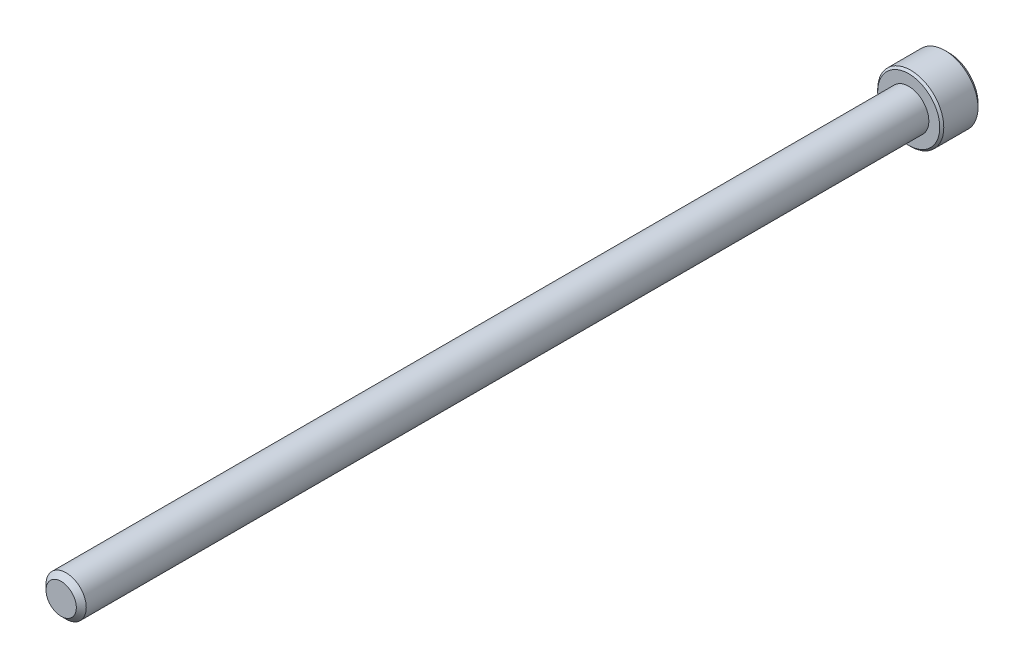
ISO-10303-21;
HEADER;
FILE_DESCRIPTION(('STEP AP214'),'2;1');
FILE_NAME('part.step','',(''),(''),'','','');
FILE_SCHEMA(('AUTOMOTIVE_DESIGN { 1 0 10303 214 1 1 1 1 }'));
ENDSEC;
DATA;
#1=APPLICATION_CONTEXT('core data for automotive mechanical design processes');
#2=APPLICATION_PROTOCOL_DEFINITION('international standard','automotive_design',2000,#1);
#3=PRODUCT_CONTEXT('',#1,'mechanical');
#4=PRODUCT('Part','Part','',(#3));
#5=PRODUCT_RELATED_PRODUCT_CATEGORY('part','',(#4));
#6=PRODUCT_DEFINITION_FORMATION('','',#4);
#7=PRODUCT_DEFINITION_CONTEXT('part definition',#1,'design');
#8=PRODUCT_DEFINITION('design','',#6,#7);
#9=PRODUCT_DEFINITION_SHAPE('','',#8);
#10=(LENGTH_UNIT() NAMED_UNIT(*) SI_UNIT(.MILLI.,.METRE.));
#11=(NAMED_UNIT(*) PLANE_ANGLE_UNIT() SI_UNIT($,.RADIAN.));
#12=(NAMED_UNIT(*) SI_UNIT($,.STERADIAN.) SOLID_ANGLE_UNIT());
#13=UNCERTAINTY_MEASURE_WITH_UNIT(LENGTH_MEASURE(1.E-05),#10,'distance_accuracy_value','');
#14=(GEOMETRIC_REPRESENTATION_CONTEXT(3) GLOBAL_UNCERTAINTY_ASSIGNED_CONTEXT((#13)) GLOBAL_UNIT_ASSIGNED_CONTEXT((#10,
#11,#12)) REPRESENTATION_CONTEXT('',''));
#15=CARTESIAN_POINT('',(0.,0.,0.));
#16=DIRECTION('',(0.,0.,1.));
#17=DIRECTION('',(1.,0.,0.));
#18=AXIS2_PLACEMENT_3D('',#15,#16,#17);
#19=CARTESIAN_POINT('',(-1.984375,-1.14567944042316,-103.4494375));
#20=DIRECTION('',(-1.,0.,0.));
#21=DIRECTION('',(0.,-1.,0.));
#22=AXIS2_PLACEMENT_3D('',#19,#20,#21);
#23=PLANE('',#22);
#24=CARTESIAN_POINT('',(-1.984375,1.14567944042726,-106.426000000022));
#25=CARTESIAN_POINT('',(-1.984375,1.06743880342641,-106.386916183692));
#26=CARTESIAN_POINT('',(-1.984375,0.987898318968138,-106.350114476914));
#27=CARTESIAN_POINT('',(-1.984375,0.825677042063346,-106.282656205069));
#28=CARTESIAN_POINT('',(-1.984375,0.742979382577644,-106.252040560673));
#29=CARTESIAN_POINT('',(-1.984375,0.575193959631352,-106.199173922886));
#30=CARTESIAN_POINT('',(-1.984375,0.490115359205708,-106.176894620859));
#31=CARTESIAN_POINT('',(-1.984375,0.31809309124422,-106.142594672261));
#32=CARTESIAN_POINT('',(-1.984375,0.231156055103307,-106.130542302325));
#33=CARTESIAN_POINT('',(-1.984375,0.119918521626714,-106.122491102664));
#34=CARTESIAN_POINT('',(-1.984375,0.0959468443972471,-106.121189475599));
#35=CARTESIAN_POINT('',(-1.984375,0.0479845644875154,-106.119451826318));
#36=CARTESIAN_POINT('',(-1.984375,0.0239939791820992,-106.119015333882));
#37=CARTESIAN_POINT('',(-1.984375,-0.0602201717358405,-106.119018090103));
#38=CARTESIAN_POINT('',(-1.984375,-0.120461721885636,-106.121774523018));
#39=CARTESIAN_POINT('',(-1.984375,-0.240474970949611,-106.132636551267));
#40=CARTESIAN_POINT('',(-1.984375,-0.300246312708982,-106.140745877513));
#41=CARTESIAN_POINT('',(-1.984375,-0.478763752725482,-106.172596229481));
#42=CARTESIAN_POINT('',(-1.984375,-0.596208828839574,-106.203854226125));
#43=CARTESIAN_POINT('',(-1.984375,-0.785921487342002,-106.267800035932));
#44=CARTESIAN_POINT('',(-1.984375,-0.859734609784853,-106.296234577704));
#45=CARTESIAN_POINT('',(-1.984375,-1.00456595514317,-106.357861404049));
#46=CARTESIAN_POINT('',(-1.984375,-1.07560356653656,-106.391007793056));
#47=CARTESIAN_POINT('',(-1.984375,-1.14567944042725,-106.426000000022));
#48=B_SPLINE_CURVE_WITH_KNOTS('',3,(#24,#25,#26,#27,#28,#29,#30,#31,#32,#33,#34,#35,#36,#37,#38,
#39,#40,#41,#42,#43,#44,#45,#46,#47),.UNSPECIFIED.,.F.,.F.,(4,2,2,2,2,2,2,2,2,2,2,4),(0.,
0.262559005170668,0.526801735764472,0.79013882429686,1.05265603847437,1.12466619174714,
1.19663719498608,1.37727026723125,1.55802937203011,1.92104085078031,2.15819130085766,
2.39317265077738),.UNSPECIFIED.);
#49=CARTESIAN_POINT('',(-1.98437500001542,1.14567944043207,-106.426000000038));
#50=VERTEX_POINT('',#49);
#51=CARTESIAN_POINT('',(-1.98437500001542,-1.14567944043207,-106.426000000038));
#52=VERTEX_POINT('',#51);
#53=EDGE_CURVE('E21',#50,#52,#48,.T.);
#54=ORIENTED_EDGE('',*,*,#53,.F.);
#55=DIRECTION('',(0.,0.,1.));
#56=VECTOR('',#55,1.);
#57=CARTESIAN_POINT('',(-1.984375,1.14567944042316,-103.4494375));
#58=LINE('',#57,#56);
#59=CARTESIAN_POINT('',(-1.984375,1.14567944042316,-103.4494375));
#60=VERTEX_POINT('',#59);
#61=EDGE_CURVE('E65',#50,#60,#58,.T.);
#62=ORIENTED_EDGE('',*,*,#61,.T.);
#63=DIRECTION('',(0.,1.,0.));
#64=VECTOR('',#63,1.);
#65=CARTESIAN_POINT('',(-1.984375,3.43703832126949,-103.4494375));
#66=LINE('',#65,#64);
#67=CARTESIAN_POINT('',(-1.984375,-1.14567944042316,-103.4494375));
#68=VERTEX_POINT('',#67);
#69=EDGE_CURVE('E70',#68,#60,#66,.T.);
#70=ORIENTED_EDGE('',*,*,#69,.F.);
#71=DIRECTION('',(0.,0.,1.));
#72=VECTOR('',#71,1.);
#73=CARTESIAN_POINT('',(-1.984375,-1.14567944042316,-103.4494375));
#74=LINE('',#73,#72);
#75=EDGE_CURVE('E68',#68,#52,#74,.F.);
#76=ORIENTED_EDGE('',*,*,#75,.T.);
#77=EDGE_LOOP('',(#54,#62,#70,#76));
#78=FACE_BOUND('',#77,.T.);
#79=ADVANCED_FACE('F17',(#78),#23,.F.);
#80=CARTESIAN_POINT('',(1.984375,3.43703832126949,-103.4494375));
#81=DIRECTION('',(0.,0.,-1.));
#82=DIRECTION('',(-1.,0.,0.));
#83=AXIS2_PLACEMENT_3D('',#80,#81,#82);
#84=PLANE('',#83);
#85=DIRECTION('',(0.866025403784439,-0.5,0.));
#86=VECTOR('',#85,1.);
#87=CARTESIAN_POINT('',(0.,-2.29135888084633,-103.4494375));
#88=LINE('',#87,#86);
#89=CARTESIAN_POINT('',(0.,-2.29135888084633,-103.4494375));
#90=VERTEX_POINT('',#89);
#91=EDGE_CURVE('E88',#90,#68,#88,.F.);
#92=ORIENTED_EDGE('',*,*,#91,.T.);
#93=ORIENTED_EDGE('',*,*,#69,.T.);
#94=DIRECTION('',(-0.866025403784439,-0.5,0.));
#95=VECTOR('',#94,1.);
#96=CARTESIAN_POINT('',(-1.984375,1.14567944042316,-103.4494375));
#97=LINE('',#96,#95);
#98=CARTESIAN_POINT('',(0.,2.29135888084633,-103.4494375));
#99=VERTEX_POINT('',#98);
#100=EDGE_CURVE('E87',#60,#99,#97,.F.);
#101=ORIENTED_EDGE('',*,*,#100,.T.);
#102=DIRECTION('',(-0.866025403784439,0.5,0.));
#103=VECTOR('',#102,1.);
#104=CARTESIAN_POINT('',(0.,2.29135888084633,-103.4494375));
#105=LINE('',#104,#103);
#106=CARTESIAN_POINT('',(1.984375,1.14567944042316,-103.4494375));
#107=VERTEX_POINT('',#106);
#108=EDGE_CURVE('E228',#99,#107,#105,.F.);
#109=ORIENTED_EDGE('',*,*,#108,.T.);
#110=DIRECTION('',(0.,1.,0.));
#111=VECTOR('',#110,1.);
#112=CARTESIAN_POINT('',(1.984375,1.14567944042316,-103.4494375));
#113=LINE('',#112,#111);
#114=CARTESIAN_POINT('',(1.984375,-1.14567944042316,-103.4494375));
#115=VERTEX_POINT('',#114);
#116=EDGE_CURVE('E233',#107,#115,#113,.F.);
#117=ORIENTED_EDGE('',*,*,#116,.T.);
#118=DIRECTION('',(0.866025403784439,0.5,0.));
#119=VECTOR('',#118,1.);
#120=CARTESIAN_POINT('',(1.984375,-1.14567944042316,-103.4494375));
#121=LINE('',#120,#119);
#122=EDGE_CURVE('E238',#115,#90,#121,.F.);
#123=ORIENTED_EDGE('',*,*,#122,.T.);
#124=EDGE_LOOP('',(#92,#93,#101,#109,#117,#123));
#125=FACE_BOUND('',#124,.T.);
#126=ADVANCED_FACE('F164',(#125),#84,.T.);
#127=CARTESIAN_POINT('',(-1.984375,1.14567944042316,-103.4494375));
#128=DIRECTION('',(-0.5,0.866025403784439,0.));
#129=DIRECTION('',(-0.866025403784439,-0.5,0.));
#130=AXIS2_PLACEMENT_3D('',#127,#128,#129);
#131=PLANE('',#130);
#132=CARTESIAN_POINT('',(-1.98437500000355,1.14567944042112,-106.426000000022));
#133=CARTESIAN_POINT('',(-1.91617106212951,1.18505700231248,-106.386660227996));
#134=CARTESIAN_POINT('',(-1.84682675301425,1.22509295784695,-106.349631328508));
#135=CARTESIAN_POINT('',(-1.70542659045884,1.30673037976177,-106.28183299432));
#136=CARTESIAN_POINT('',(-1.63335729720367,1.34833960562295,-106.251101270263));
#137=CARTESIAN_POINT('',(-1.48803310242126,1.43224256860034,-106.198457620178));
#138=CARTESIAN_POINT('',(-1.41481519063669,1.47451494967866,-106.176413412032));
#139=CARTESIAN_POINT('',(-1.2667679225302,1.55999007977273,-106.142450110749));
#140=CARTESIAN_POINT('',(-1.19194308558804,1.60319021952336,-106.130505674795));
#141=CARTESIAN_POINT('',(-1.06297903204624,1.6776476505515,-106.119728427599));
#142=CARTESIAN_POINT('',(-1.00900630840493,1.70880881707471,-106.118133528024));
#143=CARTESIAN_POINT('',(-0.901149169209138,1.77108016542342,-106.120823921462));
#144=CARTESIAN_POINT('',(-0.847264791234117,1.80219032555242,-106.125111275535));
#145=CARTESIAN_POINT('',(-0.740004920184166,1.86411684097635,-106.139322194292));
#146=CARTESIAN_POINT('',(-0.686630064024134,1.8949328285483,-106.149252060534));
#147=CARTESIAN_POINT('',(-0.580803363123029,1.95603190280101,-106.174202948524));
#148=CARTESIAN_POINT('',(-0.528351447918867,1.98631503016364,-106.189223579821));
#149=CARTESIAN_POINT('',(-0.394030915894482,2.06386502548561,-106.233804789081));
#150=CARTESIAN_POINT('',(-0.312994309044384,2.11065153226473,-106.266722133916));
#151=CARTESIAN_POINT('',(-0.193836207784153,2.17944749410345,-106.322289520462));
#152=CARTESIAN_POINT('',(-0.154568166994917,2.20211890802366,-106.341813093831));
#153=CARTESIAN_POINT('',(-0.0767591723820764,2.24704195200876,-106.38263970073));
#154=CARTESIAN_POINT('',(-0.0382177904668075,2.26929382923248,-106.4039416437));
#155=CARTESIAN_POINT('',(7.07497028716819E-12,2.29135888085041,-106.426000000024));
#156=B_SPLINE_CURVE_WITH_KNOTS('',3,(#132,#133,#134,#135,#136,#137,#138,#139,#140,#141,#142,
#143,#144,#145,#146,#147,#148,#149,#150,#151,#152,#153,#154,#155),.UNSPECIFIED.,.F.,.F.,(4,2,2,
2,2,2,2,2,2,2,2,4),(0.,0.26428490962202,0.530108996349121,0.791712695400951,1.05265800172667,
1.23942150114964,1.42625045662118,1.61328847392453,1.80031214906933,2.09727151179847,
2.24534838942469,2.39333511886696),.UNSPECIFIED.);
#157=CARTESIAN_POINT('',(-2.73131779195407E-11,2.29135888086618,-106.42600000004));
#158=VERTEX_POINT('',#157);
#159=EDGE_CURVE('E84',#50,#158,#156,.T.);
#160=ORIENTED_EDGE('',*,*,#159,.T.);
#161=DIRECTION('',(0.,0.,1.));
#162=VECTOR('',#161,1.);
#163=CARTESIAN_POINT('',(0.,2.29135888084633,-103.4494375));
#164=LINE('',#163,#162);
#165=EDGE_CURVE('E95',#158,#99,#164,.T.);
#166=ORIENTED_EDGE('',*,*,#165,.T.);
#167=ORIENTED_EDGE('',*,*,#100,.F.);
#168=ORIENTED_EDGE('',*,*,#61,.F.);
#169=EDGE_LOOP('',(#160,#166,#167,#168));
#170=FACE_BOUND('',#169,.T.);
#171=ADVANCED_FACE('F82',(#170),#131,.F.);
#172=CARTESIAN_POINT('',(0.,-2.29135888084633,-103.4494375));
#173=DIRECTION('',(-0.5,-0.866025403784439,0.));
#174=DIRECTION('',(0.866025403784439,-0.5,0.));
#175=AXIS2_PLACEMENT_3D('',#172,#173,#174);
#176=PLANE('',#175);
#177=CARTESIAN_POINT('',(7.06892580092658E-12,-2.29135888085041,-106.426000000024));
#178=CARTESIAN_POINT('',(-0.0682039378671751,-2.25198131895892,-106.386660227998));
#179=CARTESIAN_POINT('',(-0.137548246982645,-2.21194536342434,-106.34963132851));
#180=CARTESIAN_POINT('',(-0.2789484095385,-2.13030794150926,-106.281832994321));
#181=CARTESIAN_POINT('',(-0.351017702793909,-2.08869871564794,-106.251101270264));
#182=CARTESIAN_POINT('',(-0.496341897576797,-2.00479575267027,-106.198457620178));
#183=CARTESIAN_POINT('',(-0.569559809361613,-1.96252337159181,-106.176413412033));
#184=CARTESIAN_POINT('',(-0.717607077468624,-1.87704824149744,-106.142450110749));
#185=CARTESIAN_POINT('',(-0.792431914411052,-1.83384810174666,-106.130505674795));
#186=CARTESIAN_POINT('',(-0.92139596795313,-1.75939067071835,-106.119728427599));
#187=CARTESIAN_POINT('',(-0.975368691594449,-1.72822950419514,-106.118133528024));
#188=CARTESIAN_POINT('',(-1.08322583079027,-1.66595815584641,-106.120823921462));
#189=CARTESIAN_POINT('',(-1.13711020876531,-1.63484799571741,-106.125111275535));
#190=CARTESIAN_POINT('',(-1.24437007981528,-1.57292148029346,-106.139322194292));
#191=CARTESIAN_POINT('',(-1.29774493597533,-1.5421054927215,-106.149252060534));
#192=CARTESIAN_POINT('',(-1.40357163687645,-1.48100641846878,-106.174202948524));
#193=CARTESIAN_POINT('',(-1.45602355208063,-1.45072329110614,-106.189223579821));
#194=CARTESIAN_POINT('',(-1.59034408410447,-1.37317329578448,-106.23380478908));
#195=CARTESIAN_POINT('',(-1.67138069095404,-1.32638678900567,-106.266722133916));
#196=CARTESIAN_POINT('',(-1.7905387922135,-1.25759082716739,-106.322289520461));
#197=CARTESIAN_POINT('',(-1.82980683300249,-1.23491941324732,-106.34181309383));
#198=CARTESIAN_POINT('',(-1.90761582761486,-1.1899963692625,-106.382639700728));
#199=CARTESIAN_POINT('',(-1.94615720952989,-1.16774449203891,-106.403941643699));
#200=CARTESIAN_POINT('',(-1.98437500000354,-1.14567944042112,-106.426000000022));
#201=B_SPLINE_CURVE_WITH_KNOTS('',3,(#177,#178,#179,#180,#181,#182,#183,#184,#185,#186,#187,
#188,#189,#190,#191,#192,#193,#194,#195,#196,#197,#198,#199,#200),.UNSPECIFIED.,.F.,.F.,(4,2,2,
2,2,2,2,2,2,2,2,4),(0.,0.26428490962296,0.530108996351021,0.791712695403809,1.05265800173047,
1.23942150115348,1.42625045662506,1.61328847392845,1.80031214907328,2.09727151180042,
2.24534838942564,2.39333511886695),.UNSPECIFIED.);
#202=CARTESIAN_POINT('',(0.,-2.29135888086413,-106.426000000038));
#203=VERTEX_POINT('',#202);
#204=EDGE_CURVE('E94',#203,#52,#201,.T.);
#205=ORIENTED_EDGE('',*,*,#204,.T.);
#206=ORIENTED_EDGE('',*,*,#75,.F.);
#207=ORIENTED_EDGE('',*,*,#91,.F.);
#208=DIRECTION('',(0.,0.,1.));
#209=VECTOR('',#208,1.);
#210=CARTESIAN_POINT('',(0.,-2.29135888084633,-103.4494375));
#211=LINE('',#210,#209);
#212=EDGE_CURVE('E236',#90,#203,#211,.F.);
#213=ORIENTED_EDGE('',*,*,#212,.T.);
#214=EDGE_LOOP('',(#205,#206,#207,#213));
#215=FACE_BOUND('',#214,.T.);
#216=ADVANCED_FACE('F155',(#215),#176,.F.);
#217=CARTESIAN_POINT('',(1.984375,-1.14567944042316,-103.4494375));
#218=DIRECTION('',(0.5,-0.866025403784439,0.));
#219=DIRECTION('',(0.866025403784439,0.5,0.));
#220=AXIS2_PLACEMENT_3D('',#217,#218,#219);
#221=PLANE('',#220);
#222=CARTESIAN_POINT('',(1.98437500000707,-1.14567944041908,-106.426000000024));
#223=CARTESIAN_POINT('',(1.91617106213282,-1.18505700231057,-106.386660227998));
#224=CARTESIAN_POINT('',(1.84682675301734,-1.22509295784516,-106.34963132851));
#225=CARTESIAN_POINT('',(1.70542659046148,-1.30673037976024,-106.281832994321));
#226=CARTESIAN_POINT('',(1.63335729720608,-1.34833960562156,-106.251101270264));
#227=CARTESIAN_POINT('',(1.48803310242319,-1.43224256859923,-106.198457620178));
#228=CARTESIAN_POINT('',(1.41481519063837,-1.47451494967769,-106.176413412033));
#229=CARTESIAN_POINT('',(1.26676792253137,-1.55999007977206,-106.142450110749));
#230=CARTESIAN_POINT('',(1.19194308558894,-1.60319021952284,-106.130505674795));
#231=CARTESIAN_POINT('',(1.06297903204687,-1.67764765055114,-106.119728427599));
#232=CARTESIAN_POINT('',(1.00900630840555,-1.70880881707435,-106.118133528024));
#233=CARTESIAN_POINT('',(0.901149169209731,-1.77108016542308,-106.120823921462));
#234=CARTESIAN_POINT('',(0.847264791234697,-1.80219032555208,-106.125111275535));
#235=CARTESIAN_POINT('',(0.740004920184721,-1.86411684097603,-106.139322194292));
#236=CARTESIAN_POINT('',(0.686630064024676,-1.89493282854799,-106.149252060534));
#237=CARTESIAN_POINT('',(0.580803363123545,-1.95603190280071,-106.174202948524));
#238=CARTESIAN_POINT('',(0.52835144791937,-1.98631503016335,-106.189223579821));
#239=CARTESIAN_POINT('',(0.394030915894889,-2.06386502548538,-106.233804789081));
#240=CARTESIAN_POINT('',(0.312994309044714,-2.11065153226454,-106.266722133916));
#241=CARTESIAN_POINT('',(0.193836207784365,-2.17944749410333,-106.322289520462));
#242=CARTESIAN_POINT('',(0.154568166995091,-2.20211890802357,-106.341813093831));
#243=CARTESIAN_POINT('',(0.0767591723821672,-2.24704195200871,-106.38263970073));
#244=CARTESIAN_POINT('',(0.038217790466854,-2.26929382923246,-106.4039416437));
#245=CARTESIAN_POINT('',(-7.06674615680178E-12,-2.29135888085041,-106.426000000024));
#246=B_SPLINE_CURVE_WITH_KNOTS('',3,(#222,#223,#224,#225,#226,#227,#228,#229,#230,#231,#232,
#233,#234,#235,#236,#237,#238,#239,#240,#241,#242,#243,#244,#245),.UNSPECIFIED.,.F.,.F.,(4,2,2,
2,2,2,2,2,2,2,2,4),(0.,0.264284909622978,0.530108996351046,0.791712695403823,1.05265800173048,
1.23942150115348,1.42625045662506,1.61328847392845,1.80031214907329,2.09727151180271,
2.24534838942905,2.3933351188715),.UNSPECIFIED.);
#247=CARTESIAN_POINT('',(1.98437500001542,-1.14567944043207,-106.426000000038));
#248=VERTEX_POINT('',#247);
#249=EDGE_CURVE('E140',#248,#203,#246,.T.);
#250=ORIENTED_EDGE('',*,*,#249,.T.);
#251=ORIENTED_EDGE('',*,*,#212,.F.);
#252=ORIENTED_EDGE('',*,*,#122,.F.);
#253=DIRECTION('',(0.,0.,-1.));
#254=VECTOR('',#253,1.);
#255=CARTESIAN_POINT('',(1.984375,-1.14567944042316,-103.4494375));
#256=LINE('',#255,#254);
#257=EDGE_CURVE('E231',#115,#248,#256,.T.);
#258=ORIENTED_EDGE('',*,*,#257,.T.);
#259=EDGE_LOOP('',(#250,#251,#252,#258));
#260=FACE_BOUND('',#259,.T.);
#261=ADVANCED_FACE('F151',(#260),#221,.F.);
#262=CARTESIAN_POINT('',(1.984375,1.14567944042316,-103.4494375));
#263=DIRECTION('',(1.,0.,0.));
#264=DIRECTION('',(0.,0.,-1.));
#265=AXIS2_PLACEMENT_3D('',#262,#263,#264);
#266=PLANE('',#265);
#267=CARTESIAN_POINT('',(1.984375,1.14567944043133,-106.426000000024));
#268=CARTESIAN_POINT('',(1.984375,1.06692431664835,-106.386660227998));
#269=CARTESIAN_POINT('',(1.984375,0.986852405579176,-106.34963132851));
#270=CARTESIAN_POINT('',(1.984375,0.823577561749007,-106.281832994321));
#271=CARTESIAN_POINT('',(1.984375,0.740359110026371,-106.251101270264));
#272=CARTESIAN_POINT('',(1.984375,0.572553184071036,-106.198457620178));
#273=CARTESIAN_POINT('',(1.984375,0.488008421914104,-106.176413412033));
#274=CARTESIAN_POINT('',(1.984375,0.317058161725363,-106.142450110749));
#275=CARTESIAN_POINT('',(1.984375,0.230657882223802,-106.130505674795));
#276=CARTESIAN_POINT('',(1.984375,0.0817430201671957,-106.119728427599));
#277=CARTESIAN_POINT('',(1.984375,0.0194206871207716,-106.118133528024));
#278=CARTESIAN_POINT('',(1.984375,-0.105122009576688,-106.120823921462));
#279=CARTESIAN_POINT('',(1.984375,-0.167342329834692,-106.125111275535));
#280=CARTESIAN_POINT('',(1.984375,-0.291195360682589,-106.139322194292));
#281=CARTESIAN_POINT('',(1.984375,-0.352827335826508,-106.149252060534));
#282=CARTESIAN_POINT('',(1.984375,-0.475025484331944,-106.174202948524));
#283=CARTESIAN_POINT('',(1.984375,-0.535591739057228,-106.189223579821));
#284=CARTESIAN_POINT('',(1.984375,-0.690691729701281,-106.233804789081));
#285=CARTESIAN_POINT('',(1.984375,-0.784264743259605,-106.266722133916));
#286=CARTESIAN_POINT('',(1.984375,-0.921856666937178,-106.322289520462));
#287=CARTESIAN_POINT('',(1.984375,-0.967199494777654,-106.341813093831));
#288=CARTESIAN_POINT('',(1.984375,-1.05704558274794,-106.38263970073));
#289=CARTESIAN_POINT('',(1.984375,-1.10154933719543,-106.4039416437));
#290=CARTESIAN_POINT('',(1.984375,-1.14567944043133,-106.426000000024));
#291=B_SPLINE_CURVE_WITH_KNOTS('',3,(#267,#268,#269,#270,#271,#272,#273,#274,#275,#276,#277,
#278,#279,#280,#281,#282,#283,#284,#285,#286,#287,#288,#289,#290),.UNSPECIFIED.,.F.,.F.,(4,2,2,
2,2,2,2,2,2,2,2,4),(0.,0.264284909622982,0.530108996351052,0.791712695403834,1.0526580017305,
1.23942150115351,1.42625045662508,1.61328847392848,1.80031214907331,2.09727151180273,
2.24534838942908,2.39333511887151),.UNSPECIFIED.);
#292=CARTESIAN_POINT('',(1.98437500001542,1.14567944043207,-106.426000000038));
#293=VERTEX_POINT('',#292);
#294=EDGE_CURVE('E104',#293,#248,#291,.T.);
#295=ORIENTED_EDGE('',*,*,#294,.T.);
#296=ORIENTED_EDGE('',*,*,#257,.F.);
#297=ORIENTED_EDGE('',*,*,#116,.F.);
#298=DIRECTION('',(0.,0.,1.));
#299=VECTOR('',#298,1.);
#300=CARTESIAN_POINT('',(1.984375,1.14567944042316,-103.4494375));
#301=LINE('',#300,#299);
#302=EDGE_CURVE('E40',#107,#293,#301,.F.);
#303=ORIENTED_EDGE('',*,*,#302,.T.);
#304=EDGE_LOOP('',(#295,#296,#297,#303));
#305=FACE_BOUND('',#304,.T.);
#306=ADVANCED_FACE('F154',(#305),#266,.F.);
#307=CARTESIAN_POINT('',(0.,2.29135888084633,-103.4494375));
#308=DIRECTION('',(0.5,0.866025403784439,0.));
#309=DIRECTION('',(-0.866025403784439,0.5,0.));
#310=AXIS2_PLACEMENT_3D('',#307,#308,#309);
#311=PLANE('',#310);
#312=CARTESIAN_POINT('',(-7.07540131119074E-12,2.29135888085041,-106.426000000024));
#313=CARTESIAN_POINT('',(0.0682039378671736,2.25198131895892,-106.386660227998));
#314=CARTESIAN_POINT('',(0.137548246982645,2.21194536342434,-106.34963132851));
#315=CARTESIAN_POINT('',(0.278948409538505,2.13030794150925,-106.281832994321));
#316=CARTESIAN_POINT('',(0.351017702793917,2.08869871564794,-106.251101270264));
#317=CARTESIAN_POINT('',(0.496341897576807,2.00479575267027,-106.198457620178));
#318=CARTESIAN_POINT('',(0.569559809361623,1.9625233715918,-106.176413412033));
#319=CARTESIAN_POINT('',(0.717607077468629,1.87704824149743,-106.142450110749));
#320=CARTESIAN_POINT('',(0.792431914411054,1.83384810174665,-106.130505674795));
#321=CARTESIAN_POINT('',(0.921395967953129,1.75939067071835,-106.119728427599));
#322=CARTESIAN_POINT('',(0.975368691594447,1.72822950419514,-106.118133528024));
#323=CARTESIAN_POINT('',(1.08322583079027,1.66595815584641,-106.120823921462));
#324=CARTESIAN_POINT('',(1.1371102087653,1.63484799571741,-106.125111275535));
#325=CARTESIAN_POINT('',(1.24437007981528,1.57292148029346,-106.139322194292));
#326=CARTESIAN_POINT('',(1.29774493597532,1.5421054927215,-106.149252060534));
#327=CARTESIAN_POINT('',(1.40357163687646,1.48100641846878,-106.174202948524));
#328=CARTESIAN_POINT('',(1.45602355208063,1.45072329110614,-106.189223579821));
#329=CARTESIAN_POINT('',(1.59034408410512,1.37317329578411,-106.233804789081));
#330=CARTESIAN_POINT('',(1.67138069095529,1.32638678900495,-106.266722133916));
#331=CARTESIAN_POINT('',(1.79053879221565,1.25759082716616,-106.322289520462));
#332=CARTESIAN_POINT('',(1.82980683300493,1.23491941324592,-106.341813093831));
#333=CARTESIAN_POINT('',(1.90761582761785,1.18999636926077,-106.38263970073));
#334=CARTESIAN_POINT('',(1.94615720953316,1.16774449203703,-106.4039416437));
#335=CARTESIAN_POINT('',(1.98437500000707,1.14567944041908,-106.426000000024));
#336=B_SPLINE_CURVE_WITH_KNOTS('',3,(#312,#313,#314,#315,#316,#317,#318,#319,#320,#321,#322,
#323,#324,#325,#326,#327,#328,#329,#330,#331,#332,#333,#334,#335),.UNSPECIFIED.,.F.,.F.,(4,2,2,
2,2,2,2,2,2,2,2,4),(0.,0.264284909622961,0.530108996351041,0.791712695403822,1.05265800173048,
1.23942150115349,1.42625045662506,1.61328847392846,1.80031214907329,2.09727151180272,
2.24534838942908,2.39333511887151),.UNSPECIFIED.);
#337=EDGE_CURVE('E102',#158,#293,#336,.T.);
#338=ORIENTED_EDGE('',*,*,#337,.T.);
#339=ORIENTED_EDGE('',*,*,#302,.F.);
#340=ORIENTED_EDGE('',*,*,#108,.F.);
#341=ORIENTED_EDGE('',*,*,#165,.F.);
#342=EDGE_LOOP('',(#338,#339,#340,#341));
#343=FACE_BOUND('',#342,.T.);
#344=ADVANCED_FACE('F119',(#343),#311,.F.);
#345=CARTESIAN_POINT('',(0.,0.,-106.426000000113));
#346=DIRECTION('',(0.,0.,-1.));
#347=DIRECTION('',(0.,1.,0.));
#348=AXIS2_PLACEMENT_3D('',#345,#346,#347);
#349=CONICAL_SURFACE('',#348,2.29135888093879,0.785398163397448);
#350=ORIENTED_EDGE('',*,*,#159,.F.);
#351=CARTESIAN_POINT('',(0.,0.,-106.426000000056));
#352=DIRECTION('',(0.,0.,-1.));
#353=DIRECTION('',(0.,1.,0.));
#354=AXIS2_PLACEMENT_3D('',#351,#352,#353);
#355=CIRCLE('',#354,2.29135888088195);
#356=EDGE_CURVE('E78',#158,#50,#355,.F.);
#357=ORIENTED_EDGE('',*,*,#356,.F.);
#358=EDGE_LOOP('',(#350,#357));
#359=FACE_BOUND('',#358,.T.);
#360=ADVANCED_FACE('F92',(#359),#349,.F.);
#361=CARTESIAN_POINT('',(0.,0.,-106.426000000113));
#362=DIRECTION('',(0.,0.,-1.));
#363=DIRECTION('',(0.,1.,0.));
#364=AXIS2_PLACEMENT_3D('',#361,#362,#363);
#365=CONICAL_SURFACE('',#364,2.29135888093879,0.785398163397448);
#366=ORIENTED_EDGE('',*,*,#53,.T.);
#367=CARTESIAN_POINT('',(0.,0.,-106.426000000056));
#368=DIRECTION('',(0.,0.,-1.));
#369=DIRECTION('',(0.,1.,0.));
#370=AXIS2_PLACEMENT_3D('',#367,#368,#369);
#371=CIRCLE('',#370,2.29135888088194);
#372=EDGE_CURVE('E72',#50,#52,#371,.F.);
#373=ORIENTED_EDGE('',*,*,#372,.F.);
#374=EDGE_LOOP('',(#366,#373));
#375=FACE_BOUND('',#374,.T.);
#376=ADVANCED_FACE('F73',(#375),#365,.F.);
#377=CARTESIAN_POINT('',(0.,0.,-106.426000000113));
#378=DIRECTION('',(0.,0.,-1.));
#379=DIRECTION('',(0.,1.,0.));
#380=AXIS2_PLACEMENT_3D('',#377,#378,#379);
#381=CONICAL_SURFACE('',#380,2.29135888093879,0.785398163397448);
#382=ORIENTED_EDGE('',*,*,#204,.F.);
#383=CARTESIAN_POINT('',(0.,0.,-106.426000000056));
#384=DIRECTION('',(0.,0.,-1.));
#385=DIRECTION('',(0.,1.,0.));
#386=AXIS2_PLACEMENT_3D('',#383,#384,#385);
#387=CIRCLE('',#386,2.29135888088194);
#388=EDGE_CURVE('E77',#52,#203,#387,.F.);
#389=ORIENTED_EDGE('',*,*,#388,.F.);
#390=EDGE_LOOP('',(#382,#389));
#391=FACE_BOUND('',#390,.T.);
#392=ADVANCED_FACE('F137',(#391),#381,.F.);
#393=CARTESIAN_POINT('',(0.,0.,-106.426000000113));
#394=DIRECTION('',(0.,0.,-1.));
#395=DIRECTION('',(0.,1.,0.));
#396=AXIS2_PLACEMENT_3D('',#393,#394,#395);
#397=CONICAL_SURFACE('',#396,2.29135888093879,0.785398163397448);
#398=ORIENTED_EDGE('',*,*,#249,.F.);
#399=CARTESIAN_POINT('',(0.,0.,-106.426000000056));
#400=DIRECTION('',(0.,0.,-1.));
#401=DIRECTION('',(0.,1.,0.));
#402=AXIS2_PLACEMENT_3D('',#399,#400,#401);
#403=CIRCLE('',#402,2.29135888088194);
#404=EDGE_CURVE('E279',#203,#248,#403,.F.);
#405=ORIENTED_EDGE('',*,*,#404,.F.);
#406=EDGE_LOOP('',(#398,#405));
#407=FACE_BOUND('',#406,.T.);
#408=ADVANCED_FACE('F132',(#407),#397,.F.);
#409=CARTESIAN_POINT('',(0.,0.,-106.426000000113));
#410=DIRECTION('',(0.,0.,-1.));
#411=DIRECTION('',(0.,1.,0.));
#412=AXIS2_PLACEMENT_3D('',#409,#410,#411);
#413=CONICAL_SURFACE('',#412,2.29135888093879,0.785398163397448);
#414=ORIENTED_EDGE('',*,*,#294,.F.);
#415=CARTESIAN_POINT('',(0.,0.,-106.426000000056));
#416=DIRECTION('',(0.,0.,-1.));
#417=DIRECTION('',(0.,1.,0.));
#418=AXIS2_PLACEMENT_3D('',#415,#416,#417);
#419=CIRCLE('',#418,2.29135888088194);
#420=EDGE_CURVE('E277',#248,#293,#419,.F.);
#421=ORIENTED_EDGE('',*,*,#420,.F.);
#422=EDGE_LOOP('',(#414,#421));
#423=FACE_BOUND('',#422,.T.);
#424=ADVANCED_FACE('F126',(#423),#413,.F.);
#425=CARTESIAN_POINT('',(0.,0.,-106.426000000113));
#426=DIRECTION('',(0.,0.,-1.));
#427=DIRECTION('',(0.,1.,0.));
#428=AXIS2_PLACEMENT_3D('',#425,#426,#427);
#429=CONICAL_SURFACE('',#428,2.29135888093879,0.785398163397448);
#430=ORIENTED_EDGE('',*,*,#337,.F.);
#431=CARTESIAN_POINT('',(0.,0.,-106.426000000056));
#432=DIRECTION('',(0.,0.,-1.));
#433=DIRECTION('',(0.,1.,0.));
#434=AXIS2_PLACEMENT_3D('',#431,#432,#433);
#435=CIRCLE('',#434,2.29135888088195);
#436=EDGE_CURVE('E101',#293,#158,#435,.F.);
#437=ORIENTED_EDGE('',*,*,#436,.F.);
#438=EDGE_LOOP('',(#430,#437));
#439=FACE_BOUND('',#438,.T.);
#440=ADVANCED_FACE('F122',(#439),#429,.F.);
#441=CARTESIAN_POINT('',(0.,0.,-106.426));
#442=DIRECTION('',(0.,0.,-1.));
#443=DIRECTION('',(-1.,0.,0.));
#444=AXIS2_PLACEMENT_3D('',#441,#442,#443);
#445=PLANE('',#444);
#446=ORIENTED_EDGE('',*,*,#420,.T.);
#447=ORIENTED_EDGE('',*,*,#436,.T.);
#448=ORIENTED_EDGE('',*,*,#356,.T.);
#449=ORIENTED_EDGE('',*,*,#372,.T.);
#450=ORIENTED_EDGE('',*,*,#388,.T.);
#451=ORIENTED_EDGE('',*,*,#404,.T.);
#452=EDGE_LOOP('',(#446,#447,#448,#449,#450,#451));
#453=FACE_BOUND('',#452,.T.);
#454=CARTESIAN_POINT('',(0.,0.,-106.425999999885));
#455=DIRECTION('',(0.,0.,1.));
#456=DIRECTION('',(1.,0.,0.));
#457=AXIS2_PLACEMENT_3D('',#454,#455,#456);
#458=CIRCLE('',#457,3.47980000003645);
#459=CARTESIAN_POINT('',(3.47980000003645,0.,-106.425999999885));
#460=VERTEX_POINT('',#459);
#461=EDGE_CURVE('E213',#460,#460,#458,.T.);
#462=ORIENTED_EDGE('',*,*,#461,.F.);
#463=EDGE_LOOP('',(#462));
#464=FACE_BOUND('',#463,.T.);
#465=ADVANCED_FACE('F98',(#453,#464),#445,.T.);
#466=CARTESIAN_POINT('',(0.,0.,-105.943400000058));
#467=DIRECTION('',(0.,0.,1.));
#468=DIRECTION('',(1.,0.,0.));
#469=AXIS2_PLACEMENT_3D('',#466,#467,#468);
#470=CONICAL_SURFACE('',#469,3.96239999992076,0.785398163456341);
#471=ORIENTED_EDGE('',*,*,#461,.T.);
#472=EDGE_LOOP('',(#471));
#473=FACE_BOUND('',#472,.T.);
#474=CARTESIAN_POINT('',(0.,0.,-105.9434));
#475=DIRECTION('',(0.,0.,1.));
#476=DIRECTION('',(1.,0.,0.));
#477=AXIS2_PLACEMENT_3D('',#474,#475,#476);
#478=CIRCLE('',#477,3.9624);
#479=CARTESIAN_POINT('',(3.9624,0.,-105.9434));
#480=VERTEX_POINT('',#479);
#481=EDGE_CURVE('E216',#480,#480,#478,.T.);
#482=ORIENTED_EDGE('',*,*,#481,.F.);
#483=EDGE_LOOP('',(#482));
#484=FACE_BOUND('',#483,.T.);
#485=ADVANCED_FACE('F203',(#473,#484),#470,.T.);
#486=CARTESIAN_POINT('',(0.,0.,-106.426));
#487=DIRECTION('',(0.,0.,1.));
#488=DIRECTION('',(1.,0.,0.));
#489=AXIS2_PLACEMENT_3D('',#486,#487,#488);
#490=CYLINDRICAL_SURFACE('',#489,3.9624);
#491=ORIENTED_EDGE('',*,*,#481,.T.);
#492=EDGE_LOOP('',(#491));
#493=FACE_BOUND('',#492,.T.);
#494=CARTESIAN_POINT('',(0.,0.,-101.841300000046));
#495=DIRECTION('',(0.,0.,-1.));
#496=DIRECTION('',(-1.,0.,0.));
#497=AXIS2_PLACEMENT_3D('',#494,#495,#496);
#498=CIRCLE('',#497,3.96240000003445);
#499=CARTESIAN_POINT('',(-3.96240000003445,0.,-101.841300000046));
#500=VERTEX_POINT('',#499);
#501=EDGE_CURVE('E217',#500,#500,#498,.F.);
#502=ORIENTED_EDGE('',*,*,#501,.F.);
#503=EDGE_LOOP('',(#502));
#504=FACE_BOUND('',#503,.T.);
#505=ADVANCED_FACE('F200',(#493,#504),#490,.T.);
#506=CARTESIAN_POINT('',(0.,0.,-101.84129999999));
#507=DIRECTION('',(0.,0.,-1.));
#508=DIRECTION('',(0.,1.,0.));
#509=AXIS2_PLACEMENT_3D('',#506,#507,#508);
#510=CONICAL_SURFACE('',#509,3.96239999992076,0.785398163279663);
#511=CARTESIAN_POINT('',(0.,0.,-101.600000000019));
#512=DIRECTION('',(0.,0.,-1.));
#513=DIRECTION('',(0.,1.,0.));
#514=AXIS2_PLACEMENT_3D('',#511,#512,#513);
#515=CIRCLE('',#514,3.72110000000703);
#516=CARTESIAN_POINT('',(0.,3.72110000000703,-101.600000000019));
#517=VERTEX_POINT('',#516);
#518=EDGE_CURVE('E220',#517,#517,#515,.T.);
#519=ORIENTED_EDGE('',*,*,#518,.T.);
#520=EDGE_LOOP('',(#519));
#521=FACE_BOUND('',#520,.T.);
#522=ORIENTED_EDGE('',*,*,#501,.T.);
#523=EDGE_LOOP('',(#522));
#524=FACE_BOUND('',#523,.T.);
#525=ADVANCED_FACE('F196',(#521,#524),#510,.T.);
#526=CARTESIAN_POINT('',(0.,0.,0.));
#527=DIRECTION('',(0.,0.,1.));
#528=DIRECTION('',(1.,0.,0.));
#529=AXIS2_PLACEMENT_3D('',#526,#527,#528);
#530=PLANE('',#529);
#531=CARTESIAN_POINT('',(0.,0.,5.6843418860808E-11));
#532=DIRECTION('',(0.,0.,-1.));
#533=DIRECTION('',(-1.,0.,0.));
#534=AXIS2_PLACEMENT_3D('',#531,#532,#533);
#535=CIRCLE('',#534,1.81768749996536);
#536=CARTESIAN_POINT('',(-1.81768749996536,0.,5.6843418860808E-11));
#537=VERTEX_POINT('',#536);
#538=EDGE_CURVE('E271',#537,#537,#535,.T.);
#539=ORIENTED_EDGE('',*,*,#538,.F.);
#540=EDGE_LOOP('',(#539));
#541=FACE_BOUND('',#540,.T.);
#542=ADVANCED_FACE('F192',(#541),#530,.T.);
#543=CARTESIAN_POINT('',(0.,0.,-101.6));
#544=DIRECTION('',(0.,0.,-1.));
#545=DIRECTION('',(-1.,0.,0.));
#546=AXIS2_PLACEMENT_3D('',#543,#544,#545);
#547=PLANE('',#546);
#548=CARTESIAN_POINT('',(0.,0.,-101.6));
#549=DIRECTION('',(0.,0.,1.));
#550=DIRECTION('',(1.,0.,0.));
#551=AXIS2_PLACEMENT_3D('',#548,#549,#550);
#552=CIRCLE('',#551,2.413);
#553=CARTESIAN_POINT('',(2.413,0.,-101.6));
#554=VERTEX_POINT('',#553);
#555=EDGE_CURVE('E31',#554,#554,#552,.T.);
#556=ORIENTED_EDGE('',*,*,#555,.F.);
#557=EDGE_LOOP('',(#556));
#558=FACE_BOUND('',#557,.T.);
#559=ORIENTED_EDGE('',*,*,#518,.F.);
#560=EDGE_LOOP('',(#559));
#561=FACE_BOUND('',#560,.T.);
#562=ADVANCED_FACE('F185',(#558,#561),#547,.F.);
#563=CARTESIAN_POINT('',(0.,0.,-0.595312500024647));
#564=DIRECTION('',(0.,0.,-1.));
#565=DIRECTION('',(-1.,0.,0.));
#566=AXIS2_PLACEMENT_3D('',#563,#564,#565);
#567=CONICAL_SURFACE('',#566,2.41300000004685,0.785398163397448);
#568=CARTESIAN_POINT('',(0.,0.,-0.595312499999986));
#569=DIRECTION('',(0.,0.,1.));
#570=DIRECTION('',(1.,0.,0.));
#571=AXIS2_PLACEMENT_3D('',#568,#569,#570);
#572=CIRCLE('',#571,2.413);
#573=CARTESIAN_POINT('',(2.413,0.,-0.595312499999986));
#574=VERTEX_POINT('',#573);
#575=EDGE_CURVE('E11',#574,#574,#572,.F.);
#576=ORIENTED_EDGE('',*,*,#575,.F.);
#577=EDGE_LOOP('',(#576));
#578=FACE_BOUND('',#577,.T.);
#579=ORIENTED_EDGE('',*,*,#538,.T.);
#580=EDGE_LOOP('',(#579));
#581=FACE_BOUND('',#580,.T.);
#582=ADVANCED_FACE('F179',(#578,#581),#567,.T.);
#583=CARTESIAN_POINT('',(0.,0.,-101.6));
#584=DIRECTION('',(0.,0.,1.));
#585=DIRECTION('',(1.,0.,0.));
#586=AXIS2_PLACEMENT_3D('',#583,#584,#585);
#587=CYLINDRICAL_SURFACE('',#586,2.413);
#588=ORIENTED_EDGE('',*,*,#575,.T.);
#589=EDGE_LOOP('',(#588));
#590=FACE_BOUND('',#589,.T.);
#591=ORIENTED_EDGE('',*,*,#555,.T.);
#592=EDGE_LOOP('',(#591));
#593=FACE_BOUND('',#592,.T.);
#594=ADVANCED_FACE('F177',(#590,#593),#587,.T.);
#595=CLOSED_SHELL('',(#79,#126,#171,#216,#261,#306,#344,#360,#376,#392,#408,#424,#440,#465,#485,
#505,#525,#542,#562,#582,#594));
#596=MANIFOLD_SOLID_BREP('B1',#595);
#597=ADVANCED_BREP_SHAPE_REPRESENTATION('',(#18,#596),#14);
#598=SHAPE_DEFINITION_REPRESENTATION(#9,#597);
ENDSEC;
END-ISO-10303-21;
